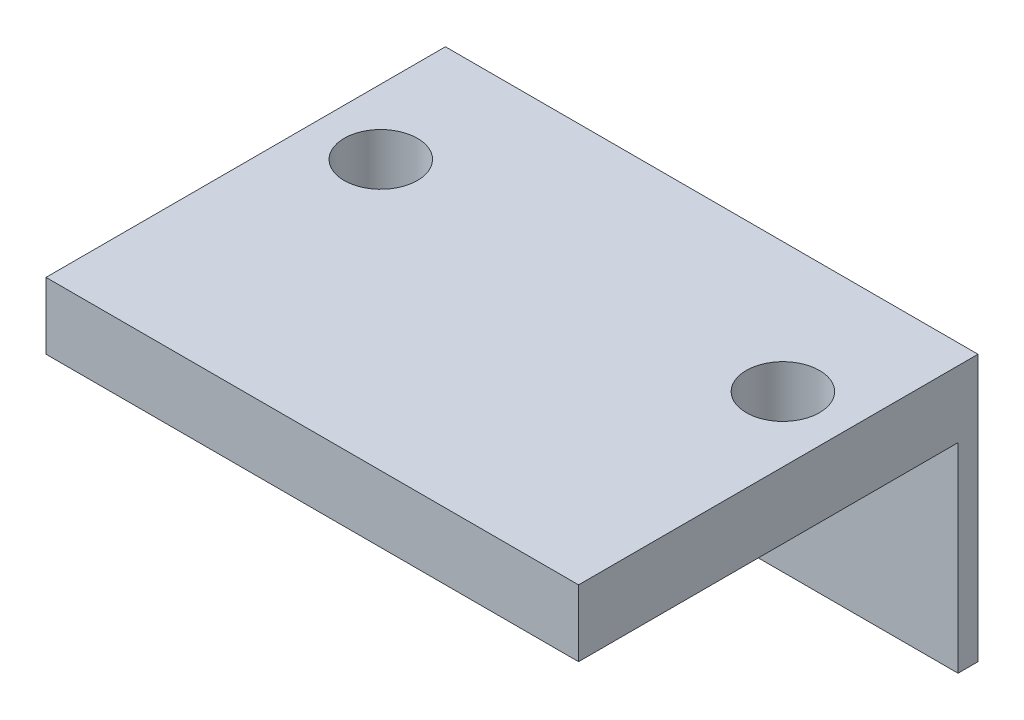
ISO-10303-21;
HEADER;
FILE_DESCRIPTION(('STEP AP214'),'2;1');
FILE_NAME('part.step','',(''),(''),'','','');
FILE_SCHEMA(('AUTOMOTIVE_DESIGN { 1 0 10303 214 1 1 1 1 }'));
ENDSEC;
DATA;
#1=APPLICATION_CONTEXT('core data for automotive mechanical design processes');
#2=APPLICATION_PROTOCOL_DEFINITION('international standard','automotive_design',2000,#1);
#3=PRODUCT_CONTEXT('',#1,'mechanical');
#4=PRODUCT('Part','Part','',(#3));
#5=PRODUCT_RELATED_PRODUCT_CATEGORY('part','',(#4));
#6=PRODUCT_DEFINITION_FORMATION('','',#4);
#7=PRODUCT_DEFINITION_CONTEXT('part definition',#1,'design');
#8=PRODUCT_DEFINITION('design','',#6,#7);
#9=PRODUCT_DEFINITION_SHAPE('','',#8);
#10=(LENGTH_UNIT() NAMED_UNIT(*) SI_UNIT(.MILLI.,.METRE.));
#11=(NAMED_UNIT(*) PLANE_ANGLE_UNIT() SI_UNIT($,.RADIAN.));
#12=(NAMED_UNIT(*) SI_UNIT($,.STERADIAN.) SOLID_ANGLE_UNIT());
#13=UNCERTAINTY_MEASURE_WITH_UNIT(LENGTH_MEASURE(1.E-05),#10,'distance_accuracy_value','');
#14=(GEOMETRIC_REPRESENTATION_CONTEXT(3) GLOBAL_UNCERTAINTY_ASSIGNED_CONTEXT((#13)) GLOBAL_UNIT_ASSIGNED_CONTEXT((#10,
#11,#12)) REPRESENTATION_CONTEXT('',''));
#15=CARTESIAN_POINT('',(0.,0.,0.));
#16=DIRECTION('',(0.,0.,1.));
#17=DIRECTION('',(1.,0.,0.));
#18=AXIS2_PLACEMENT_3D('',#15,#16,#17);
#19=CARTESIAN_POINT('',(45.,10.,35.));
#20=DIRECTION('',(-1.,0.,0.));
#21=DIRECTION('',(0.,0.,1.));
#22=AXIS2_PLACEMENT_3D('',#19,#20,#21);
#23=PLANE('',#22);
#24=DIRECTION('',(0.,0.,-1.));
#25=VECTOR('',#24,1.);
#26=CARTESIAN_POINT('',(45.,0.,35.));
#27=LINE('',#26,#25);
#28=CARTESIAN_POINT('',(45.,0.,35.));
#29=VERTEX_POINT('',#28);
#30=CARTESIAN_POINT('',(45.,0.,-22.));
#31=VERTEX_POINT('',#30);
#32=EDGE_CURVE('E143',#29,#31,#27,.T.);
#33=ORIENTED_EDGE('',*,*,#32,.T.);
#34=DIRECTION('',(0.,1.,0.));
#35=VECTOR('',#34,1.);
#36=CARTESIAN_POINT('',(45.,-30.,-22.));
#37=LINE('',#36,#35);
#38=CARTESIAN_POINT('',(45.,-30.,-22.));
#39=VERTEX_POINT('',#38);
#40=EDGE_CURVE('E105',#39,#31,#37,.T.);
#41=ORIENTED_EDGE('',*,*,#40,.F.);
#42=DIRECTION('',(0.,0.,1.));
#43=VECTOR('',#42,1.);
#44=CARTESIAN_POINT('',(45.,-30.,-25.));
#45=LINE('',#44,#43);
#46=CARTESIAN_POINT('',(45.,-30.,-25.));
#47=VERTEX_POINT('',#46);
#48=EDGE_CURVE('E103',#47,#39,#45,.T.);
#49=ORIENTED_EDGE('',*,*,#48,.F.);
#50=DIRECTION('',(0.,-1.,0.));
#51=VECTOR('',#50,1.);
#52=CARTESIAN_POINT('',(45.,10.,-25.));
#53=LINE('',#52,#51);
#54=CARTESIAN_POINT('',(45.,10.,-25.));
#55=VERTEX_POINT('',#54);
#56=EDGE_CURVE('E11',#55,#47,#53,.T.);
#57=ORIENTED_EDGE('',*,*,#56,.F.);
#58=DIRECTION('',(0.,0.,-1.));
#59=VECTOR('',#58,1.);
#60=CARTESIAN_POINT('',(45.,10.,35.));
#61=LINE('',#60,#59);
#62=CARTESIAN_POINT('',(45.,10.,35.));
#63=VERTEX_POINT('',#62);
#64=EDGE_CURVE('E152',#63,#55,#61,.T.);
#65=ORIENTED_EDGE('',*,*,#64,.F.);
#66=DIRECTION('',(0.,-1.,0.));
#67=VECTOR('',#66,1.);
#68=CARTESIAN_POINT('',(45.,10.,35.));
#69=LINE('',#68,#67);
#70=EDGE_CURVE('E153',#63,#29,#69,.T.);
#71=ORIENTED_EDGE('',*,*,#70,.T.);
#72=EDGE_LOOP('',(#33,#41,#49,#57,#65,#71));
#73=FACE_BOUND('',#72,.T.);
#74=ADVANCED_FACE('F33',(#73),#23,.F.);
#75=CARTESIAN_POINT('',(-35.,10.,-25.));
#76=DIRECTION('',(0.,0.,1.));
#77=DIRECTION('',(1.,0.,0.));
#78=AXIS2_PLACEMENT_3D('',#75,#76,#77);
#79=PLANE('',#78);
#80=ORIENTED_EDGE('',*,*,#56,.T.);
#81=DIRECTION('',(1.,0.,0.));
#82=VECTOR('',#81,1.);
#83=CARTESIAN_POINT('',(45.,-30.,-25.));
#84=LINE('',#83,#82);
#85=CARTESIAN_POINT('',(-34.9994697541973,-30.,-25.));
#86=VERTEX_POINT('',#85);
#87=EDGE_CURVE('E96',#86,#47,#84,.T.);
#88=ORIENTED_EDGE('',*,*,#87,.F.);
#89=DIRECTION('',(0.,1.,0.));
#90=VECTOR('',#89,1.);
#91=CARTESIAN_POINT('',(-34.9994697541973,-30.,-25.));
#92=LINE('',#91,#90);
#93=CARTESIAN_POINT('',(-34.9994697541973,0.,-25.));
#94=VERTEX_POINT('',#93);
#95=EDGE_CURVE('E120',#86,#94,#92,.T.);
#96=ORIENTED_EDGE('',*,*,#95,.T.);
#97=DIRECTION('',(-1.,0.,0.));
#98=VECTOR('',#97,1.);
#99=CARTESIAN_POINT('',(-35.,0.,-25.));
#100=LINE('',#99,#98);
#101=CARTESIAN_POINT('',(-35.,0.,-25.));
#102=VERTEX_POINT('',#101);
#103=EDGE_CURVE('E49',#94,#102,#100,.T.);
#104=ORIENTED_EDGE('',*,*,#103,.T.);
#105=DIRECTION('',(0.,-1.,0.));
#106=VECTOR('',#105,1.);
#107=CARTESIAN_POINT('',(-35.,10.,-25.));
#108=LINE('',#107,#106);
#109=CARTESIAN_POINT('',(-35.,10.,-25.));
#110=VERTEX_POINT('',#109);
#111=EDGE_CURVE('E41',#110,#102,#108,.T.);
#112=ORIENTED_EDGE('',*,*,#111,.F.);
#113=DIRECTION('',(-1.,0.,0.));
#114=VECTOR('',#113,1.);
#115=CARTESIAN_POINT('',(-35.,10.,-25.));
#116=LINE('',#115,#114);
#117=EDGE_CURVE('E98',#55,#110,#116,.T.);
#118=ORIENTED_EDGE('',*,*,#117,.F.);
#119=EDGE_LOOP('',(#80,#88,#96,#104,#112,#118));
#120=FACE_BOUND('',#119,.T.);
#121=ADVANCED_FACE('F93',(#120),#79,.F.);
#122=CARTESIAN_POINT('',(-35.,10.,35.));
#123=DIRECTION('',(1.,0.,0.));
#124=DIRECTION('',(0.,0.,-1.));
#125=AXIS2_PLACEMENT_3D('',#122,#123,#124);
#126=PLANE('',#125);
#127=DIRECTION('',(0.,0.,1.));
#128=VECTOR('',#127,1.);
#129=CARTESIAN_POINT('',(-35.,0.,35.));
#130=LINE('',#129,#128);
#131=CARTESIAN_POINT('',(-35.,0.,35.));
#132=VERTEX_POINT('',#131);
#133=EDGE_CURVE('E142',#102,#132,#130,.T.);
#134=ORIENTED_EDGE('',*,*,#133,.T.);
#135=DIRECTION('',(0.,-1.,0.));
#136=VECTOR('',#135,1.);
#137=CARTESIAN_POINT('',(-35.,10.,35.));
#138=LINE('',#137,#136);
#139=CARTESIAN_POINT('',(-35.,10.,35.));
#140=VERTEX_POINT('',#139);
#141=EDGE_CURVE('E156',#140,#132,#138,.T.);
#142=ORIENTED_EDGE('',*,*,#141,.F.);
#143=DIRECTION('',(0.,0.,1.));
#144=VECTOR('',#143,1.);
#145=CARTESIAN_POINT('',(-35.,10.,35.));
#146=LINE('',#145,#144);
#147=EDGE_CURVE('E165',#110,#140,#146,.T.);
#148=ORIENTED_EDGE('',*,*,#147,.F.);
#149=ORIENTED_EDGE('',*,*,#111,.T.);
#150=EDGE_LOOP('',(#134,#142,#148,#149));
#151=FACE_BOUND('',#150,.T.);
#152=ADVANCED_FACE('F163',(#151),#126,.F.);
#153=CARTESIAN_POINT('',(-35.,10.,35.));
#154=DIRECTION('',(0.,0.,-1.));
#155=DIRECTION('',(-1.,0.,0.));
#156=AXIS2_PLACEMENT_3D('',#153,#154,#155);
#157=PLANE('',#156);
#158=DIRECTION('',(1.,0.,0.));
#159=VECTOR('',#158,1.);
#160=CARTESIAN_POINT('',(-35.,0.,35.));
#161=LINE('',#160,#159);
#162=EDGE_CURVE('E150',#132,#29,#161,.T.);
#163=ORIENTED_EDGE('',*,*,#162,.T.);
#164=ORIENTED_EDGE('',*,*,#70,.F.);
#165=DIRECTION('',(1.,0.,0.));
#166=VECTOR('',#165,1.);
#167=CARTESIAN_POINT('',(-35.,10.,35.));
#168=LINE('',#167,#166);
#169=EDGE_CURVE('E157',#140,#63,#168,.T.);
#170=ORIENTED_EDGE('',*,*,#169,.F.);
#171=ORIENTED_EDGE('',*,*,#141,.T.);
#172=EDGE_LOOP('',(#163,#164,#170,#171));
#173=FACE_BOUND('',#172,.T.);
#174=ADVANCED_FACE('F171',(#173),#157,.F.);
#175=CARTESIAN_POINT('',(0.,10.,0.));
#176=DIRECTION('',(0.,-1.,0.));
#177=DIRECTION('',(0.,0.,-1.));
#178=AXIS2_PLACEMENT_3D('',#175,#176,#177);
#179=PLANE('',#178);
#180=CARTESIAN_POINT('',(35.2,10.,-5.49130345999999));
#181=DIRECTION('',(0.,1.,0.));
#182=DIRECTION('',(0.,0.,-1.));
#183=AXIS2_PLACEMENT_3D('',#180,#181,#182);
#184=CIRCLE('',#183,5.49999999999999);
#185=CARTESIAN_POINT('',(35.2,10.,-10.99130346));
#186=VERTEX_POINT('',#185);
#187=EDGE_CURVE('E131',#186,#186,#184,.T.);
#188=ORIENTED_EDGE('',*,*,#187,.F.);
#189=EDGE_LOOP('',(#188));
#190=FACE_BOUND('',#189,.T.);
#191=CARTESIAN_POINT('',(-25.20025306,10.,-5.49130345999999));
#192=DIRECTION('',(0.,1.,0.));
#193=DIRECTION('',(0.,0.,1.));
#194=AXIS2_PLACEMENT_3D('',#191,#192,#193);
#195=CIRCLE('',#194,5.5);
#196=CARTESIAN_POINT('',(-25.20025306,10.,0.00869654000000292));
#197=VERTEX_POINT('',#196);
#198=EDGE_CURVE('E177',#197,#197,#195,.T.);
#199=ORIENTED_EDGE('',*,*,#198,.F.);
#200=EDGE_LOOP('',(#199));
#201=FACE_BOUND('',#200,.T.);
#202=ORIENTED_EDGE('',*,*,#64,.T.);
#203=ORIENTED_EDGE('',*,*,#117,.T.);
#204=ORIENTED_EDGE('',*,*,#147,.T.);
#205=ORIENTED_EDGE('',*,*,#169,.T.);
#206=EDGE_LOOP('',(#202,#203,#204,#205));
#207=FACE_BOUND('',#206,.T.);
#208=ADVANCED_FACE('F180',(#190,#201,#207),#179,.F.);
#209=CARTESIAN_POINT('',(0.,0.,0.));
#210=DIRECTION('',(0.,-1.,0.));
#211=DIRECTION('',(0.,0.,-1.));
#212=AXIS2_PLACEMENT_3D('',#209,#210,#211);
#213=PLANE('',#212);
#214=DIRECTION('',(0.,0.,-1.));
#215=VECTOR('',#214,1.);
#216=CARTESIAN_POINT('',(-34.9994697541973,0.,-25.));
#217=LINE('',#216,#215);
#218=CARTESIAN_POINT('',(-34.9994697541973,0.,-22.));
#219=VERTEX_POINT('',#218);
#220=EDGE_CURVE('E114',#219,#94,#217,.T.);
#221=ORIENTED_EDGE('',*,*,#220,.F.);
#222=DIRECTION('',(-1.,0.,0.));
#223=VECTOR('',#222,1.);
#224=CARTESIAN_POINT('',(45.,0.,-22.));
#225=LINE('',#224,#223);
#226=EDGE_CURVE('E55',#31,#219,#225,.T.);
#227=ORIENTED_EDGE('',*,*,#226,.F.);
#228=ORIENTED_EDGE('',*,*,#32,.F.);
#229=ORIENTED_EDGE('',*,*,#162,.F.);
#230=ORIENTED_EDGE('',*,*,#133,.F.);
#231=ORIENTED_EDGE('',*,*,#103,.F.);
#232=EDGE_LOOP('',(#221,#227,#228,#229,#230,#231));
#233=FACE_BOUND('',#232,.T.);
#234=CARTESIAN_POINT('',(35.2,0.,-5.49130345999999));
#235=DIRECTION('',(0.,1.,0.));
#236=DIRECTION('',(0.,0.,-1.));
#237=AXIS2_PLACEMENT_3D('',#234,#235,#236);
#238=CIRCLE('',#237,5.49999999999999);
#239=CARTESIAN_POINT('',(35.2,0.,-10.99130346));
#240=VERTEX_POINT('',#239);
#241=EDGE_CURVE('E134',#240,#240,#238,.T.);
#242=ORIENTED_EDGE('',*,*,#241,.T.);
#243=EDGE_LOOP('',(#242));
#244=FACE_BOUND('',#243,.T.);
#245=CARTESIAN_POINT('',(-25.20025306,0.,-5.49130345999999));
#246=DIRECTION('',(0.,1.,0.));
#247=DIRECTION('',(0.,0.,1.));
#248=AXIS2_PLACEMENT_3D('',#245,#246,#247);
#249=CIRCLE('',#248,5.5);
#250=CARTESIAN_POINT('',(-25.20025306,0.,0.00869654000000292));
#251=VERTEX_POINT('',#250);
#252=EDGE_CURVE('E286',#251,#251,#249,.T.);
#253=ORIENTED_EDGE('',*,*,#252,.T.);
#254=EDGE_LOOP('',(#253));
#255=FACE_BOUND('',#254,.T.);
#256=ADVANCED_FACE('F167',(#233,#244,#255),#213,.T.);
#257=CARTESIAN_POINT('',(-25.20025306,0.,-5.49130345999999));
#258=DIRECTION('',(0.,1.,0.));
#259=DIRECTION('',(0.,0.,1.));
#260=AXIS2_PLACEMENT_3D('',#257,#258,#259);
#261=CYLINDRICAL_SURFACE('',#260,5.5);
#262=ORIENTED_EDGE('',*,*,#252,.F.);
#263=EDGE_LOOP('',(#262));
#264=FACE_BOUND('',#263,.T.);
#265=ORIENTED_EDGE('',*,*,#198,.T.);
#266=EDGE_LOOP('',(#265));
#267=FACE_BOUND('',#266,.T.);
#268=ADVANCED_FACE('F189',(#264,#267),#261,.F.);
#269=CARTESIAN_POINT('',(35.2,0.,-5.49130345999999));
#270=DIRECTION('',(0.,1.,0.));
#271=DIRECTION('',(0.,0.,1.));
#272=AXIS2_PLACEMENT_3D('',#269,#270,#271);
#273=CYLINDRICAL_SURFACE('',#272,5.49999999999999);
#274=ORIENTED_EDGE('',*,*,#241,.F.);
#275=EDGE_LOOP('',(#274));
#276=FACE_BOUND('',#275,.T.);
#277=ORIENTED_EDGE('',*,*,#187,.T.);
#278=EDGE_LOOP('',(#277));
#279=FACE_BOUND('',#278,.T.);
#280=ADVANCED_FACE('F225',(#276,#279),#273,.F.);
#281=CARTESIAN_POINT('',(45.,-30.,-22.));
#282=DIRECTION('',(0.,0.,-1.));
#283=DIRECTION('',(-1.,0.,0.));
#284=AXIS2_PLACEMENT_3D('',#281,#282,#283);
#285=PLANE('',#284);
#286=ORIENTED_EDGE('',*,*,#226,.T.);
#287=DIRECTION('',(0.,1.,0.));
#288=VECTOR('',#287,1.);
#289=CARTESIAN_POINT('',(-34.9994697541973,-30.,-22.));
#290=LINE('',#289,#288);
#291=CARTESIAN_POINT('',(-34.9994697541973,-30.,-22.));
#292=VERTEX_POINT('',#291);
#293=EDGE_CURVE('E123',#292,#219,#290,.T.);
#294=ORIENTED_EDGE('',*,*,#293,.F.);
#295=DIRECTION('',(-1.,0.,0.));
#296=VECTOR('',#295,1.);
#297=CARTESIAN_POINT('',(45.,-30.,-22.));
#298=LINE('',#297,#296);
#299=EDGE_CURVE('E108',#39,#292,#298,.T.);
#300=ORIENTED_EDGE('',*,*,#299,.F.);
#301=ORIENTED_EDGE('',*,*,#40,.T.);
#302=EDGE_LOOP('',(#286,#294,#300,#301));
#303=FACE_BOUND('',#302,.T.);
#304=ADVANCED_FACE('F232',(#303),#285,.F.);
#305=CARTESIAN_POINT('',(-34.9994697541973,-30.,-25.));
#306=DIRECTION('',(1.,0.,0.));
#307=DIRECTION('',(0.,0.,-1.));
#308=AXIS2_PLACEMENT_3D('',#305,#306,#307);
#309=PLANE('',#308);
#310=ORIENTED_EDGE('',*,*,#220,.T.);
#311=ORIENTED_EDGE('',*,*,#95,.F.);
#312=DIRECTION('',(0.,0.,-1.));
#313=VECTOR('',#312,1.);
#314=CARTESIAN_POINT('',(-34.9994697541973,-30.,-25.));
#315=LINE('',#314,#313);
#316=EDGE_CURVE('E112',#292,#86,#315,.T.);
#317=ORIENTED_EDGE('',*,*,#316,.F.);
#318=ORIENTED_EDGE('',*,*,#293,.T.);
#319=EDGE_LOOP('',(#310,#311,#317,#318));
#320=FACE_BOUND('',#319,.T.);
#321=ADVANCED_FACE('F254',(#320),#309,.F.);
#322=CARTESIAN_POINT('',(0.,-30.,0.));
#323=DIRECTION('',(0.,1.,0.));
#324=DIRECTION('',(0.,0.,1.));
#325=AXIS2_PLACEMENT_3D('',#322,#323,#324);
#326=PLANE('',#325);
#327=ORIENTED_EDGE('',*,*,#87,.T.);
#328=ORIENTED_EDGE('',*,*,#48,.T.);
#329=ORIENTED_EDGE('',*,*,#299,.T.);
#330=ORIENTED_EDGE('',*,*,#316,.T.);
#331=EDGE_LOOP('',(#327,#328,#329,#330));
#332=FACE_BOUND('',#331,.T.);
#333=ADVANCED_FACE('F110',(#332),#326,.F.);
#334=CLOSED_SHELL('',(#74,#121,#152,#174,#208,#256,#268,#280,#304,#321,#333));
#335=MANIFOLD_SOLID_BREP('B2',#334);
#336=ADVANCED_BREP_SHAPE_REPRESENTATION('',(#18,#335),#14);
#337=SHAPE_DEFINITION_REPRESENTATION(#9,#336);
ENDSEC;
END-ISO-10303-21;
